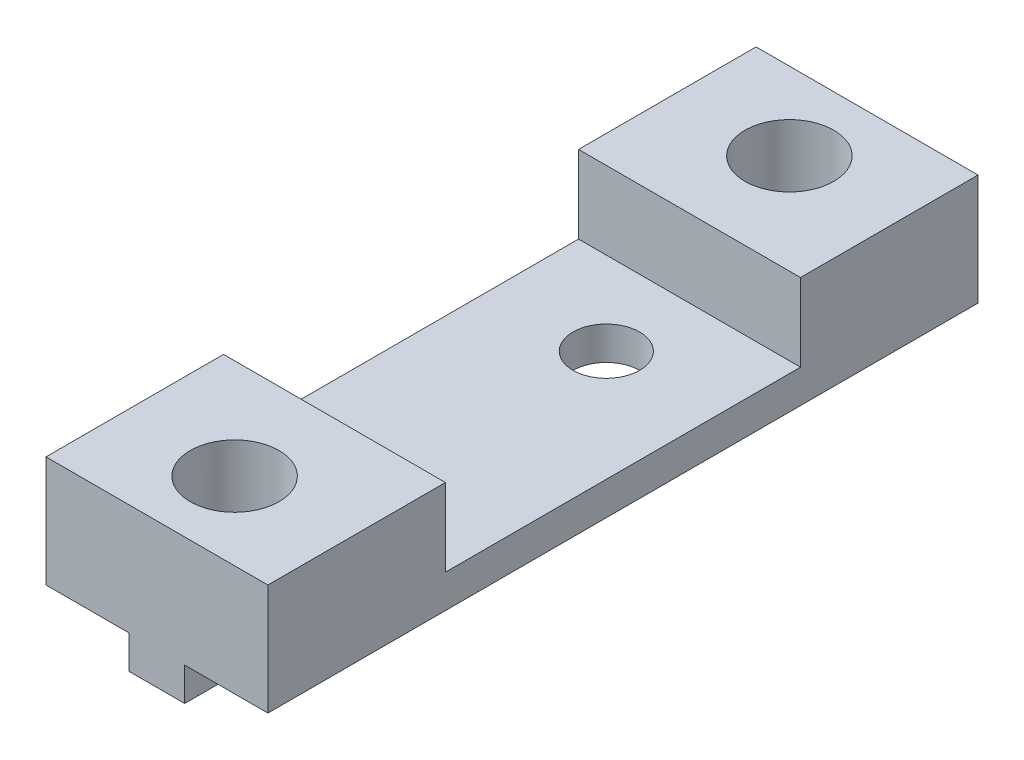
ISO-10303-21;
HEADER;
FILE_DESCRIPTION(('STEP AP214'),'2;1');
FILE_NAME('part.step','',(''),(''),'','','');
FILE_SCHEMA(('AUTOMOTIVE_DESIGN { 1 0 10303 214 1 1 1 1 }'));
ENDSEC;
DATA;
#1=APPLICATION_CONTEXT('core data for automotive mechanical design processes');
#2=APPLICATION_PROTOCOL_DEFINITION('international standard','automotive_design',2000,#1);
#3=PRODUCT_CONTEXT('',#1,'mechanical');
#4=PRODUCT('Part','Part','',(#3));
#5=PRODUCT_RELATED_PRODUCT_CATEGORY('part','',(#4));
#6=PRODUCT_DEFINITION_FORMATION('','',#4);
#7=PRODUCT_DEFINITION_CONTEXT('part definition',#1,'design');
#8=PRODUCT_DEFINITION('design','',#6,#7);
#9=PRODUCT_DEFINITION_SHAPE('','',#8);
#10=(LENGTH_UNIT() NAMED_UNIT(*) SI_UNIT(.MILLI.,.METRE.));
#11=(NAMED_UNIT(*) PLANE_ANGLE_UNIT() SI_UNIT($,.RADIAN.));
#12=(NAMED_UNIT(*) SI_UNIT($,.STERADIAN.) SOLID_ANGLE_UNIT());
#13=UNCERTAINTY_MEASURE_WITH_UNIT(LENGTH_MEASURE(1.E-05),#10,'distance_accuracy_value','');
#14=(GEOMETRIC_REPRESENTATION_CONTEXT(3) GLOBAL_UNCERTAINTY_ASSIGNED_CONTEXT((#13)) GLOBAL_UNIT_ASSIGNED_CONTEXT((#10,
#11,#12)) REPRESENTATION_CONTEXT('',''));
#15=CARTESIAN_POINT('',(0.,0.,0.));
#16=DIRECTION('',(0.,0.,1.));
#17=DIRECTION('',(1.,0.,0.));
#18=AXIS2_PLACEMENT_3D('',#15,#16,#17);
#19=CARTESIAN_POINT('',(0.,0.,0.));
#20=DIRECTION('',(0.,-1.,0.));
#21=DIRECTION('',(0.,0.,-1.));
#22=AXIS2_PLACEMENT_3D('',#19,#20,#21);
#23=PLANE('',#22);
#24=CARTESIAN_POINT('',(0.,0.,8.5));
#25=DIRECTION('',(0.,-1.,0.));
#26=DIRECTION('',(0.,0.,-1.));
#27=AXIS2_PLACEMENT_3D('',#24,#25,#26);
#28=CIRCLE('',#27,3.);
#29=CARTESIAN_POINT('',(0.,0.,5.5));
#30=VERTEX_POINT('',#29);
#31=EDGE_CURVE('E44',#30,#30,#28,.T.);
#32=ORIENTED_EDGE('',*,*,#31,.F.);
#33=EDGE_LOOP('',(#32));
#34=FACE_BOUND('',#33,.T.);
#35=DIRECTION('',(1.,0.,0.));
#36=VECTOR('',#35,1.);
#37=CARTESIAN_POINT('',(-2.5,0.,25.));
#38=LINE('',#37,#36);
#39=CARTESIAN_POINT('',(-2.5,0.,25.));
#40=VERTEX_POINT('',#39);
#41=CARTESIAN_POINT('',(2.5,0.,25.));
#42=VERTEX_POINT('',#41);
#43=EDGE_CURVE('E173',#40,#42,#38,.T.);
#44=ORIENTED_EDGE('',*,*,#43,.F.);
#45=DIRECTION('',(0.,0.,1.));
#46=VECTOR('',#45,1.);
#47=CARTESIAN_POINT('',(-2.5,0.,49.));
#48=LINE('',#47,#46);
#49=CARTESIAN_POINT('',(-2.5,0.,49.));
#50=VERTEX_POINT('',#49);
#51=EDGE_CURVE('E64',#40,#50,#48,.T.);
#52=ORIENTED_EDGE('',*,*,#51,.T.);
#53=DIRECTION('',(-1.,0.,0.));
#54=VECTOR('',#53,1.);
#55=CARTESIAN_POINT('',(-10.,0.,49.));
#56=LINE('',#55,#54);
#57=CARTESIAN_POINT('',(-10.,0.,49.));
#58=VERTEX_POINT('',#57);
#59=EDGE_CURVE('E210',#50,#58,#56,.T.);
#60=ORIENTED_EDGE('',*,*,#59,.T.);
#61=DIRECTION('',(0.,0.,1.));
#62=VECTOR('',#61,1.);
#63=CARTESIAN_POINT('',(-10.,0.,15.));
#64=LINE('',#63,#62);
#65=CARTESIAN_POINT('',(-10.,0.,-15.));
#66=VERTEX_POINT('',#65);
#67=EDGE_CURVE('E280',#66,#58,#64,.T.);
#68=ORIENTED_EDGE('',*,*,#67,.F.);
#69=DIRECTION('',(-1.,0.,0.));
#70=VECTOR('',#69,1.);
#71=CARTESIAN_POINT('',(-10.,0.,-15.));
#72=LINE('',#71,#70);
#73=CARTESIAN_POINT('',(-2.5,0.,-15.));
#74=VERTEX_POINT('',#73);
#75=EDGE_CURVE('E284',#74,#66,#72,.T.);
#76=ORIENTED_EDGE('',*,*,#75,.F.);
#77=DIRECTION('',(0.,0.,-1.));
#78=VECTOR('',#77,1.);
#79=CARTESIAN_POINT('',(-2.5,0.,-15.));
#80=LINE('',#79,#78);
#81=CARTESIAN_POINT('',(-2.5,0.,-3.));
#82=VERTEX_POINT('',#81);
#83=EDGE_CURVE('E251',#82,#74,#80,.T.);
#84=ORIENTED_EDGE('',*,*,#83,.F.);
#85=DIRECTION('',(-1.,0.,0.));
#86=VECTOR('',#85,1.);
#87=CARTESIAN_POINT('',(-2.5,0.,-3.));
#88=LINE('',#87,#86);
#89=CARTESIAN_POINT('',(2.5,0.,-3.));
#90=VERTEX_POINT('',#89);
#91=EDGE_CURVE('E260',#90,#82,#88,.T.);
#92=ORIENTED_EDGE('',*,*,#91,.F.);
#93=DIRECTION('',(0.,0.,1.));
#94=VECTOR('',#93,1.);
#95=CARTESIAN_POINT('',(2.5,0.,-15.));
#96=LINE('',#95,#94);
#97=CARTESIAN_POINT('',(2.5,0.,-15.));
#98=VERTEX_POINT('',#97);
#99=EDGE_CURVE('E246',#98,#90,#96,.T.);
#100=ORIENTED_EDGE('',*,*,#99,.F.);
#101=CARTESIAN_POINT('',(10.,0.,-15.));
#102=VERTEX_POINT('',#101);
#103=EDGE_CURVE('E285',#102,#98,#72,.T.);
#104=ORIENTED_EDGE('',*,*,#103,.F.);
#105=DIRECTION('',(0.,0.,-1.));
#106=VECTOR('',#105,1.);
#107=CARTESIAN_POINT('',(10.,0.,15.));
#108=LINE('',#107,#106);
#109=CARTESIAN_POINT('',(10.,0.,49.));
#110=VERTEX_POINT('',#109);
#111=EDGE_CURVE('E276',#110,#102,#108,.T.);
#112=ORIENTED_EDGE('',*,*,#111,.F.);
#113=CARTESIAN_POINT('',(2.5,0.,49.));
#114=VERTEX_POINT('',#113);
#115=EDGE_CURVE('E211',#110,#114,#56,.T.);
#116=ORIENTED_EDGE('',*,*,#115,.T.);
#117=DIRECTION('',(0.,0.,-1.));
#118=VECTOR('',#117,1.);
#119=CARTESIAN_POINT('',(2.5,0.,49.));
#120=LINE('',#119,#118);
#121=EDGE_CURVE('E56',#114,#42,#120,.T.);
#122=ORIENTED_EDGE('',*,*,#121,.T.);
#123=EDGE_LOOP('',(#44,#52,#60,#68,#76,#84,#92,#100,#104,#112,#116,#122));
#124=FACE_BOUND('',#123,.T.);
#125=ADVANCED_FACE('F40',(#34,#124),#23,.T.);
#126=CARTESIAN_POINT('',(0.,3.,0.));
#127=DIRECTION('',(0.,-1.,0.));
#128=DIRECTION('',(0.,0.,-1.));
#129=AXIS2_PLACEMENT_3D('',#126,#127,#128);
#130=PLANE('',#129);
#131=CARTESIAN_POINT('',(0.,3.,8.5));
#132=DIRECTION('',(0.,-1.,0.));
#133=DIRECTION('',(0.,0.,-1.));
#134=AXIS2_PLACEMENT_3D('',#131,#132,#133);
#135=CIRCLE('',#134,3.);
#136=CARTESIAN_POINT('',(0.,3.,5.5));
#137=VERTEX_POINT('',#136);
#138=EDGE_CURVE('E240',#137,#137,#135,.T.);
#139=ORIENTED_EDGE('',*,*,#138,.T.);
#140=EDGE_LOOP('',(#139));
#141=FACE_BOUND('',#140,.T.);
#142=DIRECTION('',(0.,0.,1.));
#143=VECTOR('',#142,1.);
#144=CARTESIAN_POINT('',(-10.,3.,15.));
#145=LINE('',#144,#143);
#146=CARTESIAN_POINT('',(-10.,3.,0.999999999999997));
#147=VERTEX_POINT('',#146);
#148=CARTESIAN_POINT('',(-10.,3.,33.));
#149=VERTEX_POINT('',#148);
#150=EDGE_CURVE('E279',#147,#149,#145,.T.);
#151=ORIENTED_EDGE('',*,*,#150,.T.);
#152=DIRECTION('',(1.,0.,0.));
#153=VECTOR('',#152,1.);
#154=CARTESIAN_POINT('',(0.,3.,33.));
#155=LINE('',#154,#153);
#156=CARTESIAN_POINT('',(10.,3.,33.));
#157=VERTEX_POINT('',#156);
#158=EDGE_CURVE('E190',#149,#157,#155,.T.);
#159=ORIENTED_EDGE('',*,*,#158,.T.);
#160=DIRECTION('',(0.,0.,-1.));
#161=VECTOR('',#160,1.);
#162=CARTESIAN_POINT('',(10.,3.,15.));
#163=LINE('',#162,#161);
#164=CARTESIAN_POINT('',(10.,3.,0.999999999999997));
#165=VERTEX_POINT('',#164);
#166=EDGE_CURVE('E277',#157,#165,#163,.T.);
#167=ORIENTED_EDGE('',*,*,#166,.T.);
#168=DIRECTION('',(1.,0.,0.));
#169=VECTOR('',#168,1.);
#170=CARTESIAN_POINT('',(0.,3.,0.999999999999997));
#171=LINE('',#170,#169);
#172=EDGE_CURVE('E220',#147,#165,#171,.T.);
#173=ORIENTED_EDGE('',*,*,#172,.F.);
#174=EDGE_LOOP('',(#151,#159,#167,#173));
#175=FACE_BOUND('',#174,.T.);
#176=ADVANCED_FACE('F312',(#141,#175),#130,.F.);
#177=CARTESIAN_POINT('',(10.,3.,15.));
#178=DIRECTION('',(-1.,0.,0.));
#179=DIRECTION('',(0.,0.,1.));
#180=AXIS2_PLACEMENT_3D('',#177,#178,#179);
#181=PLANE('',#180);
#182=DIRECTION('',(0.,-1.,0.));
#183=VECTOR('',#182,1.);
#184=CARTESIAN_POINT('',(10.,35.6124969497314,0.999999999999997));
#185=LINE('',#184,#183);
#186=CARTESIAN_POINT('',(10.,10.,0.999999999999997));
#187=VERTEX_POINT('',#186);
#188=EDGE_CURVE('E219',#187,#165,#185,.T.);
#189=ORIENTED_EDGE('',*,*,#188,.T.);
#190=ORIENTED_EDGE('',*,*,#166,.F.);
#191=DIRECTION('',(0.,-1.,0.));
#192=VECTOR('',#191,1.);
#193=CARTESIAN_POINT('',(10.,35.6124969497314,33.));
#194=LINE('',#193,#192);
#195=CARTESIAN_POINT('',(10.,10.,33.));
#196=VERTEX_POINT('',#195);
#197=EDGE_CURVE('E195',#196,#157,#194,.T.);
#198=ORIENTED_EDGE('',*,*,#197,.F.);
#199=DIRECTION('',(0.,0.,1.));
#200=VECTOR('',#199,1.);
#201=CARTESIAN_POINT('',(10.,10.,34.));
#202=LINE('',#201,#200);
#203=CARTESIAN_POINT('',(10.,10.,49.));
#204=VERTEX_POINT('',#203);
#205=EDGE_CURVE('E187',#196,#204,#202,.T.);
#206=ORIENTED_EDGE('',*,*,#205,.T.);
#207=DIRECTION('',(0.,-1.,0.));
#208=VECTOR('',#207,1.);
#209=CARTESIAN_POINT('',(10.,3.,49.));
#210=LINE('',#209,#208);
#211=EDGE_CURVE('E213',#204,#110,#210,.T.);
#212=ORIENTED_EDGE('',*,*,#211,.T.);
#213=ORIENTED_EDGE('',*,*,#111,.T.);
#214=DIRECTION('',(0.,-1.,0.));
#215=VECTOR('',#214,1.);
#216=CARTESIAN_POINT('',(10.,3.,-15.));
#217=LINE('',#216,#215);
#218=CARTESIAN_POINT('',(10.,10.,-15.));
#219=VERTEX_POINT('',#218);
#220=EDGE_CURVE('E11',#219,#102,#217,.T.);
#221=ORIENTED_EDGE('',*,*,#220,.F.);
#222=DIRECTION('',(0.,0.,-1.));
#223=VECTOR('',#222,1.);
#224=CARTESIAN_POINT('',(10.,10.,0.));
#225=LINE('',#224,#223);
#226=EDGE_CURVE('E231',#187,#219,#225,.T.);
#227=ORIENTED_EDGE('',*,*,#226,.F.);
#228=EDGE_LOOP('',(#189,#190,#198,#206,#212,#213,#221,#227));
#229=FACE_BOUND('',#228,.T.);
#230=ADVANCED_FACE('F42',(#229),#181,.F.);
#231=CARTESIAN_POINT('',(-10.,3.,-15.));
#232=DIRECTION('',(0.,0.,1.));
#233=DIRECTION('',(1.,0.,0.));
#234=AXIS2_PLACEMENT_3D('',#231,#232,#233);
#235=PLANE('',#234);
#236=ORIENTED_EDGE('',*,*,#103,.T.);
#237=DIRECTION('',(0.,1.,0.));
#238=VECTOR('',#237,1.);
#239=CARTESIAN_POINT('',(2.5,-3.,-15.));
#240=LINE('',#239,#238);
#241=CARTESIAN_POINT('',(2.5,-3.,-15.));
#242=VERTEX_POINT('',#241);
#243=EDGE_CURVE('E257',#242,#98,#240,.T.);
#244=ORIENTED_EDGE('',*,*,#243,.F.);
#245=DIRECTION('',(1.,0.,0.));
#246=VECTOR('',#245,1.);
#247=CARTESIAN_POINT('',(-2.5,-3.,-15.));
#248=LINE('',#247,#246);
#249=CARTESIAN_POINT('',(-2.5,-3.,-15.));
#250=VERTEX_POINT('',#249);
#251=EDGE_CURVE('E255',#250,#242,#248,.T.);
#252=ORIENTED_EDGE('',*,*,#251,.F.);
#253=DIRECTION('',(0.,1.,0.));
#254=VECTOR('',#253,1.);
#255=CARTESIAN_POINT('',(-2.5,-3.,-15.));
#256=LINE('',#255,#254);
#257=EDGE_CURVE('E267',#250,#74,#256,.T.);
#258=ORIENTED_EDGE('',*,*,#257,.T.);
#259=ORIENTED_EDGE('',*,*,#75,.T.);
#260=DIRECTION('',(0.,-1.,0.));
#261=VECTOR('',#260,1.);
#262=CARTESIAN_POINT('',(-10.,3.,-15.));
#263=LINE('',#262,#261);
#264=CARTESIAN_POINT('',(-10.,10.,-15.));
#265=VERTEX_POINT('',#264);
#266=EDGE_CURVE('E49',#265,#66,#263,.T.);
#267=ORIENTED_EDGE('',*,*,#266,.F.);
#268=DIRECTION('',(-1.,0.,0.));
#269=VECTOR('',#268,1.);
#270=CARTESIAN_POINT('',(0.,10.,-15.));
#271=LINE('',#270,#269);
#272=EDGE_CURVE('E228',#219,#265,#271,.T.);
#273=ORIENTED_EDGE('',*,*,#272,.F.);
#274=ORIENTED_EDGE('',*,*,#220,.T.);
#275=EDGE_LOOP('',(#236,#244,#252,#258,#259,#267,#273,#274));
#276=FACE_BOUND('',#275,.T.);
#277=ADVANCED_FACE('F320',(#276),#235,.F.);
#278=CARTESIAN_POINT('',(-10.,3.,15.));
#279=DIRECTION('',(1.,0.,0.));
#280=DIRECTION('',(0.,0.,-1.));
#281=AXIS2_PLACEMENT_3D('',#278,#279,#280);
#282=PLANE('',#281);
#283=ORIENTED_EDGE('',*,*,#67,.T.);
#284=DIRECTION('',(0.,-1.,0.));
#285=VECTOR('',#284,1.);
#286=CARTESIAN_POINT('',(-10.,3.,49.));
#287=LINE('',#286,#285);
#288=CARTESIAN_POINT('',(-10.,10.,49.));
#289=VERTEX_POINT('',#288);
#290=EDGE_CURVE('E216',#289,#58,#287,.T.);
#291=ORIENTED_EDGE('',*,*,#290,.F.);
#292=DIRECTION('',(0.,0.,-1.));
#293=VECTOR('',#292,1.);
#294=CARTESIAN_POINT('',(-10.,10.,34.));
#295=LINE('',#294,#293);
#296=CARTESIAN_POINT('',(-10.,10.,33.));
#297=VERTEX_POINT('',#296);
#298=EDGE_CURVE('E178',#289,#297,#295,.T.);
#299=ORIENTED_EDGE('',*,*,#298,.T.);
#300=DIRECTION('',(0.,-1.,0.));
#301=VECTOR('',#300,1.);
#302=CARTESIAN_POINT('',(-10.,35.6124969497314,33.));
#303=LINE('',#302,#301);
#304=EDGE_CURVE('E193',#297,#149,#303,.T.);
#305=ORIENTED_EDGE('',*,*,#304,.T.);
#306=ORIENTED_EDGE('',*,*,#150,.F.);
#307=DIRECTION('',(0.,-1.,0.));
#308=VECTOR('',#307,1.);
#309=CARTESIAN_POINT('',(-10.,35.6124969497314,0.999999999999997));
#310=LINE('',#309,#308);
#311=CARTESIAN_POINT('',(-10.,10.,0.999999999999997));
#312=VERTEX_POINT('',#311);
#313=EDGE_CURVE('E224',#312,#147,#310,.T.);
#314=ORIENTED_EDGE('',*,*,#313,.F.);
#315=DIRECTION('',(0.,0.,1.));
#316=VECTOR('',#315,1.);
#317=CARTESIAN_POINT('',(-10.,10.,0.));
#318=LINE('',#317,#316);
#319=EDGE_CURVE('E225',#265,#312,#318,.T.);
#320=ORIENTED_EDGE('',*,*,#319,.F.);
#321=ORIENTED_EDGE('',*,*,#266,.T.);
#322=EDGE_LOOP('',(#283,#291,#299,#305,#306,#314,#320,#321));
#323=FACE_BOUND('',#322,.T.);
#324=ADVANCED_FACE('F294',(#323),#282,.F.);
#325=CARTESIAN_POINT('',(2.5,-3.,-15.));
#326=DIRECTION('',(-1.,0.,0.));
#327=DIRECTION('',(0.,0.,1.));
#328=AXIS2_PLACEMENT_3D('',#325,#326,#327);
#329=PLANE('',#328);
#330=ORIENTED_EDGE('',*,*,#99,.T.);
#331=DIRECTION('',(0.,1.,0.));
#332=VECTOR('',#331,1.);
#333=CARTESIAN_POINT('',(2.5,-3.,-3.));
#334=LINE('',#333,#332);
#335=CARTESIAN_POINT('',(2.5,-3.,-3.));
#336=VERTEX_POINT('',#335);
#337=EDGE_CURVE('E273',#336,#90,#334,.T.);
#338=ORIENTED_EDGE('',*,*,#337,.F.);
#339=DIRECTION('',(0.,0.,1.));
#340=VECTOR('',#339,1.);
#341=CARTESIAN_POINT('',(2.5,-3.,-15.));
#342=LINE('',#341,#340);
#343=EDGE_CURVE('E247',#242,#336,#342,.T.);
#344=ORIENTED_EDGE('',*,*,#343,.F.);
#345=ORIENTED_EDGE('',*,*,#243,.T.);
#346=EDGE_LOOP('',(#330,#338,#344,#345));
#347=FACE_BOUND('',#346,.T.);
#348=ADVANCED_FACE('F326',(#347),#329,.F.);
#349=CARTESIAN_POINT('',(-2.5,-3.,-3.));
#350=DIRECTION('',(0.,0.,-1.));
#351=DIRECTION('',(-1.,0.,0.));
#352=AXIS2_PLACEMENT_3D('',#349,#350,#351);
#353=PLANE('',#352);
#354=ORIENTED_EDGE('',*,*,#91,.T.);
#355=DIRECTION('',(0.,1.,0.));
#356=VECTOR('',#355,1.);
#357=CARTESIAN_POINT('',(-2.5,-3.,-3.));
#358=LINE('',#357,#356);
#359=CARTESIAN_POINT('',(-2.5,-3.,-3.));
#360=VERTEX_POINT('',#359);
#361=EDGE_CURVE('E270',#360,#82,#358,.T.);
#362=ORIENTED_EDGE('',*,*,#361,.F.);
#363=DIRECTION('',(-1.,0.,0.));
#364=VECTOR('',#363,1.);
#365=CARTESIAN_POINT('',(-2.5,-3.,-3.));
#366=LINE('',#365,#364);
#367=EDGE_CURVE('E250',#336,#360,#366,.T.);
#368=ORIENTED_EDGE('',*,*,#367,.F.);
#369=ORIENTED_EDGE('',*,*,#337,.T.);
#370=EDGE_LOOP('',(#354,#362,#368,#369));
#371=FACE_BOUND('',#370,.T.);
#372=ADVANCED_FACE('F337',(#371),#353,.F.);
#373=CARTESIAN_POINT('',(-2.5,-3.,-15.));
#374=DIRECTION('',(1.,0.,0.));
#375=DIRECTION('',(0.,0.,-1.));
#376=AXIS2_PLACEMENT_3D('',#373,#374,#375);
#377=PLANE('',#376);
#378=ORIENTED_EDGE('',*,*,#83,.T.);
#379=ORIENTED_EDGE('',*,*,#257,.F.);
#380=DIRECTION('',(0.,0.,-1.));
#381=VECTOR('',#380,1.);
#382=CARTESIAN_POINT('',(-2.5,-3.,-15.));
#383=LINE('',#382,#381);
#384=EDGE_CURVE('E253',#360,#250,#383,.T.);
#385=ORIENTED_EDGE('',*,*,#384,.F.);
#386=ORIENTED_EDGE('',*,*,#361,.T.);
#387=EDGE_LOOP('',(#378,#379,#385,#386));
#388=FACE_BOUND('',#387,.T.);
#389=ADVANCED_FACE('F335',(#388),#377,.F.);
#390=CARTESIAN_POINT('',(0.,-3.,0.));
#391=DIRECTION('',(0.,1.,0.));
#392=DIRECTION('',(0.,0.,1.));
#393=AXIS2_PLACEMENT_3D('',#390,#391,#392);
#394=PLANE('',#393);
#395=ORIENTED_EDGE('',*,*,#343,.T.);
#396=ORIENTED_EDGE('',*,*,#367,.T.);
#397=ORIENTED_EDGE('',*,*,#384,.T.);
#398=ORIENTED_EDGE('',*,*,#251,.T.);
#399=EDGE_LOOP('',(#395,#396,#397,#398));
#400=FACE_BOUND('',#399,.T.);
#401=ADVANCED_FACE('F331',(#400),#394,.F.);
#402=CARTESIAN_POINT('',(0.,-3.,8.5));
#403=DIRECTION('',(0.,1.,0.));
#404=DIRECTION('',(0.,0.,1.));
#405=AXIS2_PLACEMENT_3D('',#402,#403,#404);
#406=CYLINDRICAL_SURFACE('',#405,3.);
#407=ORIENTED_EDGE('',*,*,#31,.T.);
#408=EDGE_LOOP('',(#407));
#409=FACE_BOUND('',#408,.T.);
#410=ORIENTED_EDGE('',*,*,#138,.F.);
#411=EDGE_LOOP('',(#410));
#412=FACE_BOUND('',#411,.T.);
#413=ADVANCED_FACE('F390',(#409,#412),#406,.F.);
#414=CARTESIAN_POINT('',(0.,35.6124969497314,0.999999999999997));
#415=DIRECTION('',(0.,0.,-1.));
#416=DIRECTION('',(-1.,0.,0.));
#417=AXIS2_PLACEMENT_3D('',#414,#415,#416);
#418=PLANE('',#417);
#419=DIRECTION('',(1.,0.,0.));
#420=VECTOR('',#419,1.);
#421=CARTESIAN_POINT('',(0.,10.,0.999999999999997));
#422=LINE('',#421,#420);
#423=EDGE_CURVE('E223',#312,#187,#422,.T.);
#424=ORIENTED_EDGE('',*,*,#423,.F.);
#425=ORIENTED_EDGE('',*,*,#313,.T.);
#426=ORIENTED_EDGE('',*,*,#172,.T.);
#427=ORIENTED_EDGE('',*,*,#188,.F.);
#428=EDGE_LOOP('',(#424,#425,#426,#427));
#429=FACE_BOUND('',#428,.T.);
#430=ADVANCED_FACE('F315',(#429),#418,.F.);
#431=CARTESIAN_POINT('',(0.,10.,-8.));
#432=DIRECTION('',(0.,-1.,0.));
#433=DIRECTION('',(0.,0.,-1.));
#434=AXIS2_PLACEMENT_3D('',#431,#432,#433);
#435=CYLINDRICAL_SURFACE('',#434,4.);
#436=CARTESIAN_POINT('',(0.,10.,-8.));
#437=DIRECTION('',(0.,1.,0.));
#438=DIRECTION('',(0.,0.,1.));
#439=AXIS2_PLACEMENT_3D('',#436,#437,#438);
#440=CIRCLE('',#439,4.);
#441=CARTESIAN_POINT('',(0.,10.,-4.));
#442=VERTEX_POINT('',#441);
#443=EDGE_CURVE('E243',#442,#442,#440,.T.);
#444=ORIENTED_EDGE('',*,*,#443,.T.);
#445=EDGE_LOOP('',(#444));
#446=FACE_BOUND('',#445,.T.);
#447=CARTESIAN_POINT('',(0.,2.5,-8.));
#448=DIRECTION('',(0.,1.,0.));
#449=DIRECTION('',(0.,0.,1.));
#450=AXIS2_PLACEMENT_3D('',#447,#448,#449);
#451=CIRCLE('',#450,4.);
#452=CARTESIAN_POINT('',(0.,2.5,-4.));
#453=VERTEX_POINT('',#452);
#454=EDGE_CURVE('E555',#453,#453,#451,.T.);
#455=ORIENTED_EDGE('',*,*,#454,.F.);
#456=EDGE_LOOP('',(#455));
#457=FACE_BOUND('',#456,.T.);
#458=ADVANCED_FACE('F380',(#446,#457),#435,.F.);
#459=CARTESIAN_POINT('',(0.,10.,-8.));
#460=DIRECTION('',(0.,1.,0.));
#461=DIRECTION('',(0.,0.,1.));
#462=AXIS2_PLACEMENT_3D('',#459,#460,#461);
#463=PLANE('',#462);
#464=ORIENTED_EDGE('',*,*,#272,.T.);
#465=ORIENTED_EDGE('',*,*,#319,.T.);
#466=ORIENTED_EDGE('',*,*,#423,.T.);
#467=ORIENTED_EDGE('',*,*,#226,.T.);
#468=EDGE_LOOP('',(#464,#465,#466,#467));
#469=FACE_BOUND('',#468,.T.);
#470=ORIENTED_EDGE('',*,*,#443,.F.);
#471=EDGE_LOOP('',(#470));
#472=FACE_BOUND('',#471,.T.);
#473=ADVANCED_FACE('F318',(#469,#472),#463,.T.);
#474=CARTESIAN_POINT('',(-10.,3.,49.));
#475=DIRECTION('',(0.,0.,1.));
#476=DIRECTION('',(1.,0.,0.));
#477=AXIS2_PLACEMENT_3D('',#474,#475,#476);
#478=PLANE('',#477);
#479=ORIENTED_EDGE('',*,*,#115,.F.);
#480=ORIENTED_EDGE('',*,*,#211,.F.);
#481=DIRECTION('',(-1.,0.,0.));
#482=VECTOR('',#481,1.);
#483=CARTESIAN_POINT('',(0.,10.,49.));
#484=LINE('',#483,#482);
#485=EDGE_CURVE('E197',#204,#289,#484,.T.);
#486=ORIENTED_EDGE('',*,*,#485,.T.);
#487=ORIENTED_EDGE('',*,*,#290,.T.);
#488=ORIENTED_EDGE('',*,*,#59,.F.);
#489=DIRECTION('',(0.,1.,0.));
#490=VECTOR('',#489,1.);
#491=CARTESIAN_POINT('',(-2.5,-3.,49.));
#492=LINE('',#491,#490);
#493=CARTESIAN_POINT('',(-2.5,-3.,49.));
#494=VERTEX_POINT('',#493);
#495=EDGE_CURVE('E205',#494,#50,#492,.T.);
#496=ORIENTED_EDGE('',*,*,#495,.F.);
#497=DIRECTION('',(1.,0.,0.));
#498=VECTOR('',#497,1.);
#499=CARTESIAN_POINT('',(-2.5,-3.,49.));
#500=LINE('',#499,#498);
#501=CARTESIAN_POINT('',(2.5,-3.,49.));
#502=VERTEX_POINT('',#501);
#503=EDGE_CURVE('E166',#494,#502,#500,.T.);
#504=ORIENTED_EDGE('',*,*,#503,.T.);
#505=DIRECTION('',(0.,1.,0.));
#506=VECTOR('',#505,1.);
#507=CARTESIAN_POINT('',(2.5,-3.,49.));
#508=LINE('',#507,#506);
#509=EDGE_CURVE('E161',#502,#114,#508,.T.);
#510=ORIENTED_EDGE('',*,*,#509,.T.);
#511=EDGE_LOOP('',(#479,#480,#486,#487,#488,#496,#504,#510));
#512=FACE_BOUND('',#511,.T.);
#513=ADVANCED_FACE('F299',(#512),#478,.T.);
#514=CARTESIAN_POINT('',(2.5,-3.,49.));
#515=DIRECTION('',(1.,0.,0.));
#516=DIRECTION('',(0.,0.,-1.));
#517=AXIS2_PLACEMENT_3D('',#514,#515,#516);
#518=PLANE('',#517);
#519=ORIENTED_EDGE('',*,*,#121,.F.);
#520=ORIENTED_EDGE('',*,*,#509,.F.);
#521=DIRECTION('',(0.,0.,-1.));
#522=VECTOR('',#521,1.);
#523=CARTESIAN_POINT('',(2.5,-3.,49.));
#524=LINE('',#523,#522);
#525=CARTESIAN_POINT('',(2.5,-3.,25.));
#526=VERTEX_POINT('',#525);
#527=EDGE_CURVE('E156',#502,#526,#524,.T.);
#528=ORIENTED_EDGE('',*,*,#527,.T.);
#529=DIRECTION('',(0.,-1.,0.));
#530=VECTOR('',#529,1.);
#531=CARTESIAN_POINT('',(2.5,0.,25.));
#532=LINE('',#531,#530);
#533=EDGE_CURVE('E159',#42,#526,#532,.T.);
#534=ORIENTED_EDGE('',*,*,#533,.F.);
#535=EDGE_LOOP('',(#519,#520,#528,#534));
#536=FACE_BOUND('',#535,.T.);
#537=ADVANCED_FACE('F158',(#536),#518,.T.);
#538=CARTESIAN_POINT('',(-2.5,-3.,49.));
#539=DIRECTION('',(-1.,0.,0.));
#540=DIRECTION('',(0.,0.,1.));
#541=AXIS2_PLACEMENT_3D('',#538,#539,#540);
#542=PLANE('',#541);
#543=ORIENTED_EDGE('',*,*,#51,.F.);
#544=DIRECTION('',(0.,1.,0.));
#545=VECTOR('',#544,1.);
#546=CARTESIAN_POINT('',(-2.5,-3.,25.));
#547=LINE('',#546,#545);
#548=CARTESIAN_POINT('',(-2.5,-3.,25.));
#549=VERTEX_POINT('',#548);
#550=EDGE_CURVE('E557',#549,#40,#547,.T.);
#551=ORIENTED_EDGE('',*,*,#550,.F.);
#552=DIRECTION('',(0.,0.,1.));
#553=VECTOR('',#552,1.);
#554=CARTESIAN_POINT('',(-2.5,-3.,49.));
#555=LINE('',#554,#553);
#556=EDGE_CURVE('E177',#549,#494,#555,.T.);
#557=ORIENTED_EDGE('',*,*,#556,.T.);
#558=ORIENTED_EDGE('',*,*,#495,.T.);
#559=EDGE_LOOP('',(#543,#551,#557,#558));
#560=FACE_BOUND('',#559,.T.);
#561=ADVANCED_FACE('F485',(#560),#542,.T.);
#562=CARTESIAN_POINT('',(0.,-3.,34.));
#563=DIRECTION('',(0.,1.,0.));
#564=DIRECTION('',(0.,0.,-1.));
#565=AXIS2_PLACEMENT_3D('',#562,#563,#564);
#566=PLANE('',#565);
#567=ORIENTED_EDGE('',*,*,#527,.F.);
#568=ORIENTED_EDGE('',*,*,#503,.F.);
#569=ORIENTED_EDGE('',*,*,#556,.F.);
#570=DIRECTION('',(-1.,0.,0.));
#571=VECTOR('',#570,1.);
#572=CARTESIAN_POINT('',(2.5,-3.,25.));
#573=LINE('',#572,#571);
#574=EDGE_CURVE('E172',#526,#549,#573,.T.);
#575=ORIENTED_EDGE('',*,*,#574,.F.);
#576=EDGE_LOOP('',(#567,#568,#569,#575));
#577=FACE_BOUND('',#576,.T.);
#578=ADVANCED_FACE('F175',(#577),#566,.F.);
#579=CARTESIAN_POINT('',(0.,35.6124969497314,33.));
#580=DIRECTION('',(0.,0.,-1.));
#581=DIRECTION('',(-1.,0.,0.));
#582=AXIS2_PLACEMENT_3D('',#579,#580,#581);
#583=PLANE('',#582);
#584=ORIENTED_EDGE('',*,*,#304,.F.);
#585=DIRECTION('',(1.,0.,0.));
#586=VECTOR('',#585,1.);
#587=CARTESIAN_POINT('',(0.,10.,33.));
#588=LINE('',#587,#586);
#589=EDGE_CURVE('E181',#297,#196,#588,.T.);
#590=ORIENTED_EDGE('',*,*,#589,.T.);
#591=ORIENTED_EDGE('',*,*,#197,.T.);
#592=ORIENTED_EDGE('',*,*,#158,.F.);
#593=EDGE_LOOP('',(#584,#590,#591,#592));
#594=FACE_BOUND('',#593,.T.);
#595=ADVANCED_FACE('F309',(#594),#583,.T.);
#596=CARTESIAN_POINT('',(0.,10.,42.));
#597=DIRECTION('',(0.,-1.,0.));
#598=DIRECTION('',(0.,0.,-1.));
#599=AXIS2_PLACEMENT_3D('',#596,#597,#598);
#600=CYLINDRICAL_SURFACE('',#599,4.);
#601=CARTESIAN_POINT('',(0.,10.,42.));
#602=DIRECTION('',(0.,-1.,0.));
#603=DIRECTION('',(0.,0.,-1.));
#604=AXIS2_PLACEMENT_3D('',#601,#602,#603);
#605=CIRCLE('',#604,4.);
#606=CARTESIAN_POINT('',(0.,10.,38.));
#607=VERTEX_POINT('',#606);
#608=EDGE_CURVE('E200',#607,#607,#605,.T.);
#609=ORIENTED_EDGE('',*,*,#608,.F.);
#610=EDGE_LOOP('',(#609));
#611=FACE_BOUND('',#610,.T.);
#612=CARTESIAN_POINT('',(0.,2.5,42.));
#613=DIRECTION('',(0.,1.,0.));
#614=DIRECTION('',(0.,0.,1.));
#615=AXIS2_PLACEMENT_3D('',#612,#613,#614);
#616=CIRCLE('',#615,4.);
#617=CARTESIAN_POINT('',(0.,2.5,46.));
#618=VERTEX_POINT('',#617);
#619=EDGE_CURVE('E558',#618,#618,#616,.T.);
#620=ORIENTED_EDGE('',*,*,#619,.F.);
#621=EDGE_LOOP('',(#620));
#622=FACE_BOUND('',#621,.T.);
#623=ADVANCED_FACE('F459',(#611,#622),#600,.F.);
#624=CARTESIAN_POINT('',(0.,10.,42.));
#625=DIRECTION('',(0.,1.,0.));
#626=DIRECTION('',(0.,0.,-1.));
#627=AXIS2_PLACEMENT_3D('',#624,#625,#626);
#628=PLANE('',#627);
#629=ORIENTED_EDGE('',*,*,#608,.T.);
#630=EDGE_LOOP('',(#629));
#631=FACE_BOUND('',#630,.T.);
#632=ORIENTED_EDGE('',*,*,#298,.F.);
#633=ORIENTED_EDGE('',*,*,#485,.F.);
#634=ORIENTED_EDGE('',*,*,#205,.F.);
#635=ORIENTED_EDGE('',*,*,#589,.F.);
#636=EDGE_LOOP('',(#632,#633,#634,#635));
#637=FACE_BOUND('',#636,.T.);
#638=ADVANCED_FACE('F306',(#631,#637),#628,.T.);
#639=CARTESIAN_POINT('',(0.,0.,25.));
#640=DIRECTION('',(0.,0.,-1.));
#641=DIRECTION('',(-1.,0.,0.));
#642=AXIS2_PLACEMENT_3D('',#639,#640,#641);
#643=PLANE('',#642);
#644=ORIENTED_EDGE('',*,*,#550,.T.);
#645=ORIENTED_EDGE('',*,*,#43,.T.);
#646=ORIENTED_EDGE('',*,*,#533,.T.);
#647=ORIENTED_EDGE('',*,*,#574,.T.);
#648=EDGE_LOOP('',(#644,#645,#646,#647));
#649=FACE_BOUND('',#648,.T.);
#650=ADVANCED_FACE('F171',(#649),#643,.T.);
#651=CARTESIAN_POINT('',(0.,2.5,42.));
#652=DIRECTION('',(0.,1.,0.));
#653=DIRECTION('',(0.,0.,1.));
#654=AXIS2_PLACEMENT_3D('',#651,#652,#653);
#655=PLANE('',#654);
#656=ORIENTED_EDGE('',*,*,#619,.T.);
#657=EDGE_LOOP('',(#656));
#658=FACE_BOUND('',#657,.T.);
#659=ADVANCED_FACE('F511',(#658),#655,.T.);
#660=CARTESIAN_POINT('',(0.,2.5,-8.));
#661=DIRECTION('',(0.,1.,0.));
#662=DIRECTION('',(0.,0.,1.));
#663=AXIS2_PLACEMENT_3D('',#660,#661,#662);
#664=PLANE('',#663);
#665=ORIENTED_EDGE('',*,*,#454,.T.);
#666=EDGE_LOOP('',(#665));
#667=FACE_BOUND('',#666,.T.);
#668=ADVANCED_FACE('F539',(#667),#664,.T.);
#669=CLOSED_SHELL('',(#125,#176,#230,#277,#324,#348,#372,#389,#401,#413,#430,#458,#473,#513,
#537,#561,#578,#595,#623,#638,#650,#659,#668));
#670=MANIFOLD_SOLID_BREP('B2',#669);
#671=ADVANCED_BREP_SHAPE_REPRESENTATION('',(#18,#670),#14);
#672=SHAPE_DEFINITION_REPRESENTATION(#9,#671);
ENDSEC;
END-ISO-10303-21;
